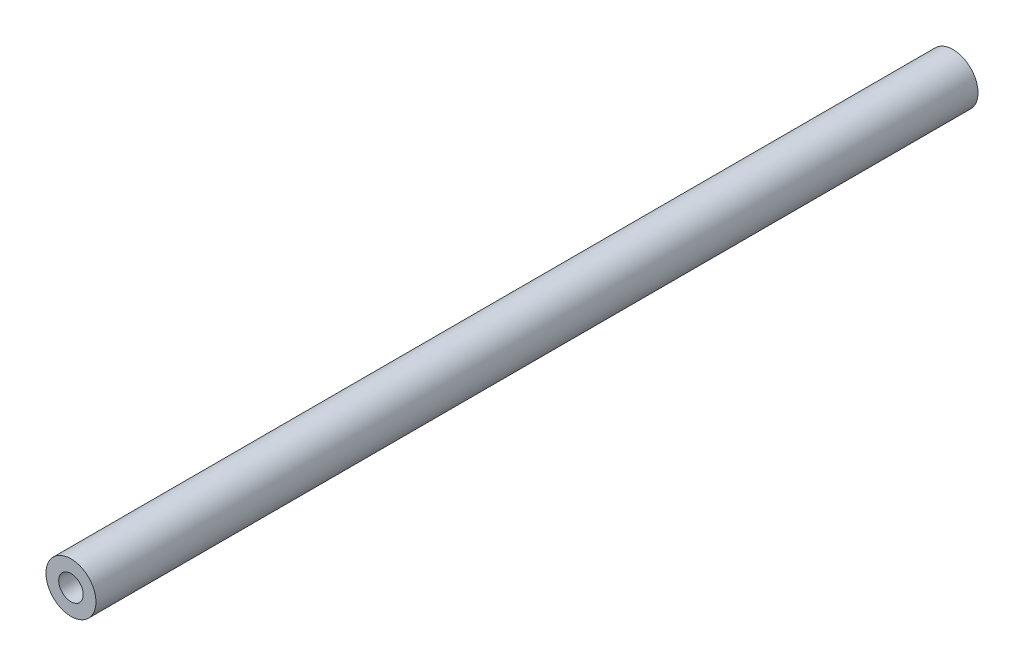
ISO-10303-21;
HEADER;
FILE_DESCRIPTION(('STEP AP214'),'2;1');
FILE_NAME('part.step','',(''),(''),'','','');
FILE_SCHEMA(('AUTOMOTIVE_DESIGN { 1 0 10303 214 1 1 1 1 }'));
ENDSEC;
DATA;
#1=APPLICATION_CONTEXT('core data for automotive mechanical design processes');
#2=APPLICATION_PROTOCOL_DEFINITION('international standard','automotive_design',2000,#1);
#3=PRODUCT_CONTEXT('',#1,'mechanical');
#4=PRODUCT('Part','Part','',(#3));
#5=PRODUCT_RELATED_PRODUCT_CATEGORY('part','',(#4));
#6=PRODUCT_DEFINITION_FORMATION('','',#4);
#7=PRODUCT_DEFINITION_CONTEXT('part definition',#1,'design');
#8=PRODUCT_DEFINITION('design','',#6,#7);
#9=PRODUCT_DEFINITION_SHAPE('','',#8);
#10=(LENGTH_UNIT() NAMED_UNIT(*) SI_UNIT(.MILLI.,.METRE.));
#11=(NAMED_UNIT(*) PLANE_ANGLE_UNIT() SI_UNIT($,.RADIAN.));
#12=(NAMED_UNIT(*) SI_UNIT($,.STERADIAN.) SOLID_ANGLE_UNIT());
#13=UNCERTAINTY_MEASURE_WITH_UNIT(LENGTH_MEASURE(1.E-05),#10,'distance_accuracy_value','');
#14=(GEOMETRIC_REPRESENTATION_CONTEXT(3) GLOBAL_UNCERTAINTY_ASSIGNED_CONTEXT((#13)) GLOBAL_UNIT_ASSIGNED_CONTEXT((#10,
#11,#12)) REPRESENTATION_CONTEXT('',''));
#15=CARTESIAN_POINT('',(0.,0.,0.));
#16=DIRECTION('',(0.,0.,1.));
#17=DIRECTION('',(1.,0.,0.));
#18=AXIS2_PLACEMENT_3D('',#15,#16,#17);
#19=CARTESIAN_POINT('',(0.,0.,228.6));
#20=DIRECTION('',(0.,0.,1.));
#21=DIRECTION('',(1.,0.,0.));
#22=AXIS2_PLACEMENT_3D('',#19,#20,#21);
#23=PLANE('',#22);
#24=CARTESIAN_POINT('',(0.,0.,228.6));
#25=DIRECTION('',(0.,0.,1.));
#26=DIRECTION('',(1.,0.,0.));
#27=AXIS2_PLACEMENT_3D('',#24,#25,#26);
#28=CIRCLE('',#27,6.477);
#29=CARTESIAN_POINT('',(6.477,0.,228.6));
#30=VERTEX_POINT('',#29);
#31=EDGE_CURVE('E105',#30,#30,#28,.T.);
#32=ORIENTED_EDGE('',*,*,#31,.T.);
#33=EDGE_LOOP('',(#32));
#34=FACE_BOUND('',#33,.T.);
#35=CARTESIAN_POINT('',(0.,0.,228.6));
#36=DIRECTION('',(0.,0.,1.));
#37=DIRECTION('',(1.,0.,0.));
#38=AXIS2_PLACEMENT_3D('',#35,#36,#37);
#39=CIRCLE('',#38,3.175);
#40=CARTESIAN_POINT('',(3.175,0.,228.6));
#41=VERTEX_POINT('',#40);
#42=EDGE_CURVE('E99',#41,#41,#39,.T.);
#43=ORIENTED_EDGE('',*,*,#42,.F.);
#44=EDGE_LOOP('',(#43));
#45=FACE_BOUND('',#44,.T.);
#46=ADVANCED_FACE('F33',(#34,#45),#23,.T.);
#47=CARTESIAN_POINT('',(0.,0.,0.));
#48=DIRECTION('',(0.,0.,1.));
#49=DIRECTION('',(1.,0.,0.));
#50=AXIS2_PLACEMENT_3D('',#47,#48,#49);
#51=PLANE('',#50);
#52=CARTESIAN_POINT('',(0.,0.,0.));
#53=DIRECTION('',(0.,0.,1.));
#54=DIRECTION('',(1.,0.,0.));
#55=AXIS2_PLACEMENT_3D('',#52,#53,#54);
#56=CIRCLE('',#55,6.477);
#57=CARTESIAN_POINT('',(6.477,0.,0.));
#58=VERTEX_POINT('',#57);
#59=EDGE_CURVE('E102',#58,#58,#56,.T.);
#60=ORIENTED_EDGE('',*,*,#59,.F.);
#61=EDGE_LOOP('',(#60));
#62=FACE_BOUND('',#61,.T.);
#63=CARTESIAN_POINT('',(0.,0.,0.));
#64=DIRECTION('',(0.,0.,1.));
#65=DIRECTION('',(1.,0.,0.));
#66=AXIS2_PLACEMENT_3D('',#63,#64,#65);
#67=CIRCLE('',#66,3.175);
#68=CARTESIAN_POINT('',(3.175,0.,0.));
#69=VERTEX_POINT('',#68);
#70=EDGE_CURVE('E81',#69,#69,#67,.T.);
#71=ORIENTED_EDGE('',*,*,#70,.T.);
#72=EDGE_LOOP('',(#71));
#73=FACE_BOUND('',#72,.T.);
#74=ADVANCED_FACE('F133',(#62,#73),#51,.F.);
#75=CARTESIAN_POINT('',(0.,0.,228.6));
#76=DIRECTION('',(0.,0.,-1.));
#77=DIRECTION('',(-1.,0.,0.));
#78=AXIS2_PLACEMENT_3D('',#75,#76,#77);
#79=CYLINDRICAL_SURFACE('',#78,6.477);
#80=CARTESIAN_POINT('',(0.,0.,192.0875));
#81=DIRECTION('',(0.,0.,1.));
#82=DIRECTION('',(1.,0.,0.));
#83=AXIS2_PLACEMENT_3D('',#80,#81,#82);
#84=CIRCLE('',#83,6.477);
#85=CARTESIAN_POINT('',(-6.477,0.,192.0875));
#86=VERTEX_POINT('',#85);
#87=CARTESIAN_POINT('',(1.143,-6.37534940218966,192.0875));
#88=VERTEX_POINT('',#87);
#89=EDGE_CURVE('E94',#86,#88,#84,.T.);
#90=ORIENTED_EDGE('',*,*,#89,.T.);
#91=DIRECTION('',(0.,0.,-1.));
#92=VECTOR('',#91,1.);
#93=CARTESIAN_POINT('',(1.143,-6.37534940218966,228.6));
#94=LINE('',#93,#92);
#95=CARTESIAN_POINT('',(1.143,-6.37534940218966,184.15));
#96=VERTEX_POINT('',#95);
#97=EDGE_CURVE('E77',#88,#96,#94,.T.);
#98=ORIENTED_EDGE('',*,*,#97,.T.);
#99=CARTESIAN_POINT('',(0.,0.,184.15));
#100=DIRECTION('',(0.,0.,-1.));
#101=DIRECTION('',(-1.,0.,0.));
#102=AXIS2_PLACEMENT_3D('',#99,#100,#101);
#103=CIRCLE('',#102,6.477);
#104=CARTESIAN_POINT('',(-6.477,0.,184.15));
#105=VERTEX_POINT('',#104);
#106=EDGE_CURVE('E73',#96,#105,#103,.T.);
#107=ORIENTED_EDGE('',*,*,#106,.T.);
#108=DIRECTION('',(0.,0.,1.));
#109=VECTOR('',#108,1.);
#110=CARTESIAN_POINT('',(-6.477,0.,192.0875));
#111=LINE('',#110,#109);
#112=EDGE_CURVE('E75',#105,#86,#111,.T.);
#113=ORIENTED_EDGE('',*,*,#112,.T.);
#114=EDGE_LOOP('',(#90,#98,#107,#113));
#115=FACE_BOUND('',#114,.T.);
#116=ORIENTED_EDGE('',*,*,#31,.F.);
#117=EDGE_LOOP('',(#116));
#118=FACE_BOUND('',#117,.T.);
#119=ORIENTED_EDGE('',*,*,#59,.T.);
#120=EDGE_LOOP('',(#119));
#121=FACE_BOUND('',#120,.T.);
#122=ADVANCED_FACE('F35',(#115,#118,#121),#79,.T.);
#123=CARTESIAN_POINT('',(0.,0.,228.6));
#124=DIRECTION('',(0.,0.,-1.));
#125=DIRECTION('',(-1.,0.,0.));
#126=AXIS2_PLACEMENT_3D('',#123,#124,#125);
#127=CYLINDRICAL_SURFACE('',#126,3.175);
#128=CARTESIAN_POINT('',(0.,0.,184.15));
#129=DIRECTION('',(0.,0.,-1.));
#130=DIRECTION('',(-1.,0.,0.));
#131=AXIS2_PLACEMENT_3D('',#128,#129,#130);
#132=CIRCLE('',#131,3.175);
#133=CARTESIAN_POINT('',(1.143,-2.96212356258141,184.15));
#134=VERTEX_POINT('',#133);
#135=CARTESIAN_POINT('',(-3.175,0.,184.15));
#136=VERTEX_POINT('',#135);
#137=EDGE_CURVE('E11',#134,#136,#132,.T.);
#138=ORIENTED_EDGE('',*,*,#137,.F.);
#139=DIRECTION('',(0.,0.,-1.));
#140=VECTOR('',#139,1.);
#141=CARTESIAN_POINT('',(1.143,-2.96212356258141,228.6));
#142=LINE('',#141,#140);
#143=CARTESIAN_POINT('',(1.143,-2.96212356258141,192.0875));
#144=VERTEX_POINT('',#143);
#145=EDGE_CURVE('E41',#144,#134,#142,.T.);
#146=ORIENTED_EDGE('',*,*,#145,.F.);
#147=CARTESIAN_POINT('',(0.,0.,192.0875));
#148=DIRECTION('',(0.,0.,1.));
#149=DIRECTION('',(1.,0.,0.));
#150=AXIS2_PLACEMENT_3D('',#147,#148,#149);
#151=CIRCLE('',#150,3.175);
#152=CARTESIAN_POINT('',(-3.175,0.,192.0875));
#153=VERTEX_POINT('',#152);
#154=EDGE_CURVE('E112',#153,#144,#151,.T.);
#155=ORIENTED_EDGE('',*,*,#154,.F.);
#156=DIRECTION('',(0.,0.,-1.));
#157=VECTOR('',#156,1.);
#158=CARTESIAN_POINT('',(-3.175,0.,228.6));
#159=LINE('',#158,#157);
#160=EDGE_CURVE('E108',#153,#136,#159,.T.);
#161=ORIENTED_EDGE('',*,*,#160,.T.);
#162=EDGE_LOOP('',(#138,#146,#155,#161));
#163=FACE_BOUND('',#162,.T.);
#164=ORIENTED_EDGE('',*,*,#42,.T.);
#165=EDGE_LOOP('',(#164));
#166=FACE_BOUND('',#165,.T.);
#167=ORIENTED_EDGE('',*,*,#70,.F.);
#168=EDGE_LOOP('',(#167));
#169=FACE_BOUND('',#168,.T.);
#170=ADVANCED_FACE('F119',(#163,#166,#169),#127,.F.);
#171=CARTESIAN_POINT('',(-6.477,-6.477,184.15));
#172=DIRECTION('',(0.,0.,-1.));
#173=DIRECTION('',(-1.,0.,0.));
#174=AXIS2_PLACEMENT_3D('',#171,#172,#173);
#175=PLANE('',#174);
#176=DIRECTION('',(0.,1.,0.));
#177=VECTOR('',#176,1.);
#178=CARTESIAN_POINT('',(1.143,-6.477,184.15));
#179=LINE('',#178,#177);
#180=EDGE_CURVE('E92',#96,#134,#179,.T.);
#181=ORIENTED_EDGE('',*,*,#180,.T.);
#182=ORIENTED_EDGE('',*,*,#137,.T.);
#183=DIRECTION('',(-1.,0.,0.));
#184=VECTOR('',#183,1.);
#185=CARTESIAN_POINT('',(-6.477,0.,184.15));
#186=LINE('',#185,#184);
#187=EDGE_CURVE('E53',#136,#105,#186,.T.);
#188=ORIENTED_EDGE('',*,*,#187,.T.);
#189=ORIENTED_EDGE('',*,*,#106,.F.);
#190=EDGE_LOOP('',(#181,#182,#188,#189));
#191=FACE_BOUND('',#190,.T.);
#192=ADVANCED_FACE('F83',(#191),#175,.F.);
#193=CARTESIAN_POINT('',(1.143,-6.477,192.0875));
#194=DIRECTION('',(1.,0.,0.));
#195=DIRECTION('',(0.,0.,-1.));
#196=AXIS2_PLACEMENT_3D('',#193,#194,#195);
#197=PLANE('',#196);
#198=DIRECTION('',(0.,1.,0.));
#199=VECTOR('',#198,1.);
#200=CARTESIAN_POINT('',(1.143,-6.477,192.0875));
#201=LINE('',#200,#199);
#202=EDGE_CURVE('E86',#88,#144,#201,.T.);
#203=ORIENTED_EDGE('',*,*,#202,.T.);
#204=ORIENTED_EDGE('',*,*,#145,.T.);
#205=ORIENTED_EDGE('',*,*,#180,.F.);
#206=ORIENTED_EDGE('',*,*,#97,.F.);
#207=EDGE_LOOP('',(#203,#204,#205,#206));
#208=FACE_BOUND('',#207,.T.);
#209=ADVANCED_FACE('F115',(#208),#197,.F.);
#210=CARTESIAN_POINT('',(-6.477,-6.477,192.0875));
#211=DIRECTION('',(0.,0.,1.));
#212=DIRECTION('',(1.,0.,0.));
#213=AXIS2_PLACEMENT_3D('',#210,#211,#212);
#214=PLANE('',#213);
#215=DIRECTION('',(1.,0.,0.));
#216=VECTOR('',#215,1.);
#217=CARTESIAN_POINT('',(-6.477,0.,192.0875));
#218=LINE('',#217,#216);
#219=EDGE_CURVE('E48',#86,#153,#218,.T.);
#220=ORIENTED_EDGE('',*,*,#219,.T.);
#221=ORIENTED_EDGE('',*,*,#154,.T.);
#222=ORIENTED_EDGE('',*,*,#202,.F.);
#223=ORIENTED_EDGE('',*,*,#89,.F.);
#224=EDGE_LOOP('',(#220,#221,#222,#223));
#225=FACE_BOUND('',#224,.T.);
#226=ADVANCED_FACE('F122',(#225),#214,.F.);
#227=CARTESIAN_POINT('',(0.,0.,0.));
#228=DIRECTION('',(0.,-1.,0.));
#229=DIRECTION('',(0.,0.,-1.));
#230=AXIS2_PLACEMENT_3D('',#227,#228,#229);
#231=PLANE('',#230);
#232=ORIENTED_EDGE('',*,*,#219,.F.);
#233=ORIENTED_EDGE('',*,*,#112,.F.);
#234=ORIENTED_EDGE('',*,*,#187,.F.);
#235=ORIENTED_EDGE('',*,*,#160,.F.);
#236=EDGE_LOOP('',(#232,#233,#234,#235));
#237=FACE_BOUND('',#236,.T.);
#238=ADVANCED_FACE('F88',(#237),#231,.T.);
#239=CLOSED_SHELL('',(#46,#74,#122,#170,#192,#209,#226,#238));
#240=MANIFOLD_SOLID_BREP('B2',#239);
#241=ADVANCED_BREP_SHAPE_REPRESENTATION('',(#18,#240),#14);
#242=SHAPE_DEFINITION_REPRESENTATION(#9,#241);
ENDSEC;
END-ISO-10303-21;
